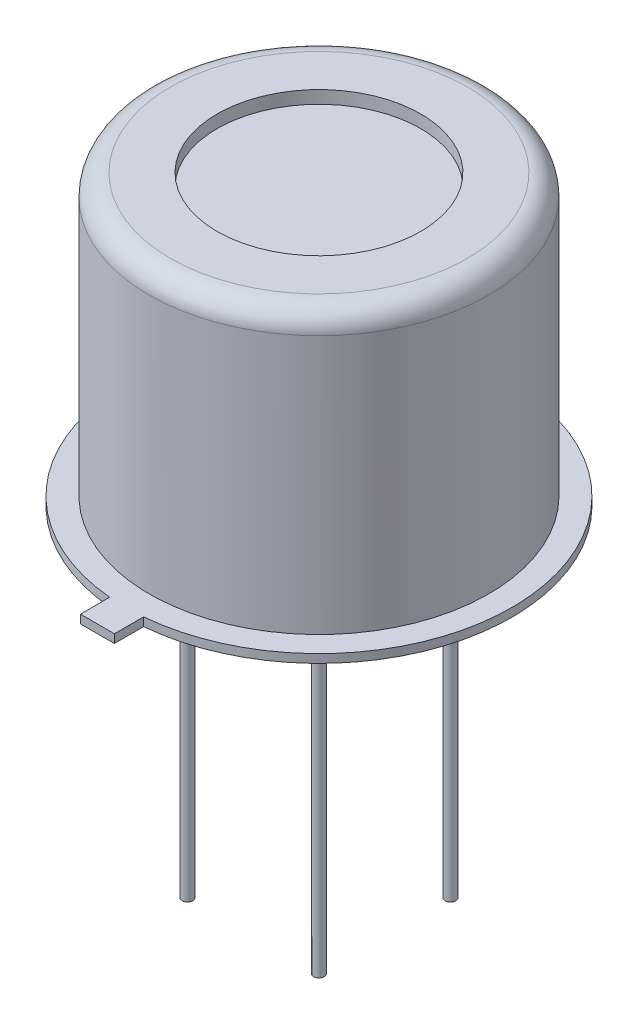
ISO-10303-21;
HEADER;
FILE_DESCRIPTION(('STEP AP214'),'2;1');
FILE_NAME('part.step','',(''),(''),'','','');
FILE_SCHEMA(('AUTOMOTIVE_DESIGN { 1 0 10303 214 1 1 1 1 }'));
ENDSEC;
DATA;
#1=APPLICATION_CONTEXT('core data for automotive mechanical design processes');
#2=APPLICATION_PROTOCOL_DEFINITION('international standard','automotive_design',2000,#1);
#3=PRODUCT_CONTEXT('',#1,'mechanical');
#4=PRODUCT('Part','Part','',(#3));
#5=PRODUCT_RELATED_PRODUCT_CATEGORY('part','',(#4));
#6=PRODUCT_DEFINITION_FORMATION('','',#4);
#7=PRODUCT_DEFINITION_CONTEXT('part definition',#1,'design');
#8=PRODUCT_DEFINITION('design','',#6,#7);
#9=PRODUCT_DEFINITION_SHAPE('','',#8);
#10=(LENGTH_UNIT() NAMED_UNIT(*) SI_UNIT(.MILLI.,.METRE.));
#11=(NAMED_UNIT(*) PLANE_ANGLE_UNIT() SI_UNIT($,.RADIAN.));
#12=(NAMED_UNIT(*) SI_UNIT($,.STERADIAN.) SOLID_ANGLE_UNIT());
#13=UNCERTAINTY_MEASURE_WITH_UNIT(LENGTH_MEASURE(1.E-05),#10,'distance_accuracy_value','');
#14=(GEOMETRIC_REPRESENTATION_CONTEXT(3) GLOBAL_UNCERTAINTY_ASSIGNED_CONTEXT((#13)) GLOBAL_UNIT_ASSIGNED_CONTEXT((#10,
#11,#12)) REPRESENTATION_CONTEXT('',''));
#15=CARTESIAN_POINT('',(0.,0.,0.));
#16=DIRECTION('',(0.,0.,1.));
#17=DIRECTION('',(1.,0.,0.));
#18=AXIS2_PLACEMENT_3D('',#15,#16,#17);
#19=CARTESIAN_POINT('',(0.,-0.2,0.));
#20=DIRECTION('',(0.,-1.,0.));
#21=DIRECTION('',(0.,0.,-1.));
#22=AXIS2_PLACEMENT_3D('',#19,#20,#21);
#23=PLANE('',#22);
#24=CARTESIAN_POINT('',(1.55,-0.2,-1.55));
#25=DIRECTION('',(0.,-1.,0.));
#26=DIRECTION('',(0.,0.,-1.));
#27=AXIS2_PLACEMENT_3D('',#24,#25,#26);
#28=CIRCLE('',#27,0.125);
#29=CARTESIAN_POINT('',(1.55,-0.2,-1.675));
#30=VERTEX_POINT('',#29);
#31=EDGE_CURVE('E312',#30,#30,#28,.T.);
#32=ORIENTED_EDGE('',*,*,#31,.F.);
#33=EDGE_LOOP('',(#32));
#34=FACE_BOUND('',#33,.T.);
#35=CARTESIAN_POINT('',(-1.55,-0.2,1.55));
#36=DIRECTION('',(0.,-1.,0.));
#37=DIRECTION('',(0.,0.,-1.));
#38=AXIS2_PLACEMENT_3D('',#35,#36,#37);
#39=CIRCLE('',#38,0.125);
#40=CARTESIAN_POINT('',(-1.55,-0.2,1.425));
#41=VERTEX_POINT('',#40);
#42=EDGE_CURVE('E327',#41,#41,#39,.T.);
#43=ORIENTED_EDGE('',*,*,#42,.F.);
#44=EDGE_LOOP('',(#43));
#45=FACE_BOUND('',#44,.T.);
#46=CARTESIAN_POINT('',(0.,-0.2,0.));
#47=DIRECTION('',(0.,-1.,0.));
#48=DIRECTION('',(0.,0.,-1.));
#49=AXIS2_PLACEMENT_3D('',#46,#47,#48);
#50=CIRCLE('',#49,4.55);
#51=CARTESIAN_POINT('',(-0.4,-0.2,4.53238347892144));
#52=VERTEX_POINT('',#51);
#53=CARTESIAN_POINT('',(0.4,-0.2,4.53238347892144));
#54=VERTEX_POINT('',#53);
#55=EDGE_CURVE('E112',#52,#54,#50,.T.);
#56=ORIENTED_EDGE('',*,*,#55,.T.);
#57=DIRECTION('',(0.,0.,1.));
#58=VECTOR('',#57,1.);
#59=CARTESIAN_POINT('',(0.4,-0.2,5.22227190057123));
#60=LINE('',#59,#58);
#61=CARTESIAN_POINT('',(0.4,-0.2,5.22227190057123));
#62=VERTEX_POINT('',#61);
#63=EDGE_CURVE('E103',#54,#62,#60,.T.);
#64=ORIENTED_EDGE('',*,*,#63,.T.);
#65=DIRECTION('',(-1.,0.,0.));
#66=VECTOR('',#65,1.);
#67=CARTESIAN_POINT('',(-0.4,-0.2,5.22227190057123));
#68=LINE('',#67,#66);
#69=CARTESIAN_POINT('',(-0.4,-0.2,5.22227190057123));
#70=VERTEX_POINT('',#69);
#71=EDGE_CURVE('E94',#62,#70,#68,.T.);
#72=ORIENTED_EDGE('',*,*,#71,.T.);
#73=DIRECTION('',(0.,0.,-1.));
#74=VECTOR('',#73,1.);
#75=CARTESIAN_POINT('',(-0.4,-0.2,5.22227190057123));
#76=LINE('',#75,#74);
#77=EDGE_CURVE('E50',#70,#52,#76,.T.);
#78=ORIENTED_EDGE('',*,*,#77,.T.);
#79=EDGE_LOOP('',(#56,#64,#72,#78));
#80=FACE_BOUND('',#79,.T.);
#81=CARTESIAN_POINT('',(1.55,-0.2,1.55));
#82=DIRECTION('',(0.,-1.,0.));
#83=DIRECTION('',(0.,0.,1.));
#84=AXIS2_PLACEMENT_3D('',#81,#82,#83);
#85=CIRCLE('',#84,0.125);
#86=CARTESIAN_POINT('',(1.55,-0.2,1.675));
#87=VERTEX_POINT('',#86);
#88=EDGE_CURVE('E322',#87,#87,#85,.T.);
#89=ORIENTED_EDGE('',*,*,#88,.F.);
#90=EDGE_LOOP('',(#89));
#91=FACE_BOUND('',#90,.T.);
#92=CARTESIAN_POINT('',(-1.55,-0.2,-1.55));
#93=DIRECTION('',(0.,-1.,0.));
#94=DIRECTION('',(0.,0.,1.));
#95=AXIS2_PLACEMENT_3D('',#92,#93,#94);
#96=CIRCLE('',#95,0.125);
#97=CARTESIAN_POINT('',(-1.55,-0.2,-1.425));
#98=VERTEX_POINT('',#97);
#99=EDGE_CURVE('E313',#98,#98,#96,.T.);
#100=ORIENTED_EDGE('',*,*,#99,.F.);
#101=EDGE_LOOP('',(#100));
#102=FACE_BOUND('',#101,.T.);
#103=ADVANCED_FACE('F35',(#34,#45,#80,#91,#102),#23,.T.);
#104=CARTESIAN_POINT('',(0.,6.6,0.));
#105=DIRECTION('',(0.,-1.,0.));
#106=DIRECTION('',(0.,0.,-1.));
#107=AXIS2_PLACEMENT_3D('',#104,#105,#106);
#108=CYLINDRICAL_SURFACE('',#107,4.);
#109=CARTESIAN_POINT('',(0.,6.1,0.));
#110=DIRECTION('',(0.,1.,0.));
#111=DIRECTION('',(0.,0.,1.));
#112=AXIS2_PLACEMENT_3D('',#109,#110,#111);
#113=CIRCLE('',#112,4.);
#114=CARTESIAN_POINT('',(0.,6.1,4.));
#115=VERTEX_POINT('',#114);
#116=EDGE_CURVE('E11',#115,#115,#113,.F.);
#117=ORIENTED_EDGE('',*,*,#116,.T.);
#118=EDGE_LOOP('',(#117));
#119=FACE_BOUND('',#118,.T.);
#120=CARTESIAN_POINT('',(0.,0.,0.));
#121=DIRECTION('',(0.,-1.,0.));
#122=DIRECTION('',(0.,0.,-1.));
#123=AXIS2_PLACEMENT_3D('',#120,#121,#122);
#124=CIRCLE('',#123,4.);
#125=CARTESIAN_POINT('',(0.,0.,-4.));
#126=VERTEX_POINT('',#125);
#127=EDGE_CURVE('E114',#126,#126,#124,.T.);
#128=ORIENTED_EDGE('',*,*,#127,.F.);
#129=EDGE_LOOP('',(#128));
#130=FACE_BOUND('',#129,.T.);
#131=ADVANCED_FACE('F139',(#119,#130),#108,.T.);
#132=CARTESIAN_POINT('',(0.,6.6,0.));
#133=DIRECTION('',(0.,1.,0.));
#134=DIRECTION('',(0.,0.,1.));
#135=AXIS2_PLACEMENT_3D('',#132,#133,#134);
#136=PLANE('',#135);
#137=CARTESIAN_POINT('',(0.,6.6,0.));
#138=DIRECTION('',(0.,1.,0.));
#139=DIRECTION('',(0.,0.,1.));
#140=AXIS2_PLACEMENT_3D('',#137,#138,#139);
#141=CIRCLE('',#140,3.5);
#142=CARTESIAN_POINT('',(0.,6.6,3.5));
#143=VERTEX_POINT('',#142);
#144=EDGE_CURVE('E43',#143,#143,#141,.T.);
#145=ORIENTED_EDGE('',*,*,#144,.T.);
#146=EDGE_LOOP('',(#145));
#147=FACE_BOUND('',#146,.T.);
#148=CARTESIAN_POINT('',(0.,6.6,0.));
#149=DIRECTION('',(0.,1.,0.));
#150=DIRECTION('',(0.,0.,1.));
#151=AXIS2_PLACEMENT_3D('',#148,#149,#150);
#152=CIRCLE('',#151,2.4);
#153=CARTESIAN_POINT('',(0.,6.6,2.4));
#154=VERTEX_POINT('',#153);
#155=EDGE_CURVE('E333',#154,#154,#152,.T.);
#156=ORIENTED_EDGE('',*,*,#155,.F.);
#157=EDGE_LOOP('',(#156));
#158=FACE_BOUND('',#157,.T.);
#159=ADVANCED_FACE('F120',(#147,#158),#136,.T.);
#160=CARTESIAN_POINT('',(0.,0.,0.));
#161=DIRECTION('',(0.,-1.,0.));
#162=DIRECTION('',(0.,0.,-1.));
#163=AXIS2_PLACEMENT_3D('',#160,#161,#162);
#164=PLANE('',#163);
#165=DIRECTION('',(0.,0.,1.));
#166=VECTOR('',#165,1.);
#167=CARTESIAN_POINT('',(0.4,0.,5.22227190057123));
#168=LINE('',#167,#166);
#169=CARTESIAN_POINT('',(0.4,0.,4.53238347892144));
#170=VERTEX_POINT('',#169);
#171=CARTESIAN_POINT('',(0.4,0.,5.22227190057123));
#172=VERTEX_POINT('',#171);
#173=EDGE_CURVE('E78',#170,#172,#168,.T.);
#174=ORIENTED_EDGE('',*,*,#173,.F.);
#175=CARTESIAN_POINT('',(0.,0.,0.));
#176=DIRECTION('',(0.,-1.,0.));
#177=DIRECTION('',(0.,0.,-1.));
#178=AXIS2_PLACEMENT_3D('',#175,#176,#177);
#179=CIRCLE('',#178,4.55);
#180=CARTESIAN_POINT('',(-0.4,0.,4.53238347892144));
#181=VERTEX_POINT('',#180);
#182=EDGE_CURVE('E111',#181,#170,#179,.T.);
#183=ORIENTED_EDGE('',*,*,#182,.F.);
#184=DIRECTION('',(0.,0.,-1.));
#185=VECTOR('',#184,1.);
#186=CARTESIAN_POINT('',(-0.4,0.,5.22227190057123));
#187=LINE('',#186,#185);
#188=CARTESIAN_POINT('',(-0.4,0.,5.22227190057123));
#189=VERTEX_POINT('',#188);
#190=EDGE_CURVE('E57',#189,#181,#187,.T.);
#191=ORIENTED_EDGE('',*,*,#190,.F.);
#192=DIRECTION('',(-1.,0.,0.));
#193=VECTOR('',#192,1.);
#194=CARTESIAN_POINT('',(-0.4,0.,5.22227190057123));
#195=LINE('',#194,#193);
#196=EDGE_CURVE('E89',#172,#189,#195,.T.);
#197=ORIENTED_EDGE('',*,*,#196,.F.);
#198=EDGE_LOOP('',(#174,#183,#191,#197));
#199=FACE_BOUND('',#198,.T.);
#200=ORIENTED_EDGE('',*,*,#127,.T.);
#201=EDGE_LOOP('',(#200));
#202=FACE_BOUND('',#201,.T.);
#203=ADVANCED_FACE('F97',(#199,#202),#164,.F.);
#204=CARTESIAN_POINT('',(0.,-0.2,0.));
#205=DIRECTION('',(0.,1.,0.));
#206=DIRECTION('',(0.,0.,1.));
#207=AXIS2_PLACEMENT_3D('',#204,#205,#206);
#208=CYLINDRICAL_SURFACE('',#207,4.55);
#209=ORIENTED_EDGE('',*,*,#55,.F.);
#210=DIRECTION('',(0.,1.,0.));
#211=VECTOR('',#210,1.);
#212=CARTESIAN_POINT('',(-0.4,-0.2,4.53238347892144));
#213=LINE('',#212,#211);
#214=EDGE_CURVE('E109',#52,#181,#213,.T.);
#215=ORIENTED_EDGE('',*,*,#214,.T.);
#216=ORIENTED_EDGE('',*,*,#182,.T.);
#217=DIRECTION('',(0.,1.,0.));
#218=VECTOR('',#217,1.);
#219=CARTESIAN_POINT('',(0.4,-0.2,4.53238347892144));
#220=LINE('',#219,#218);
#221=EDGE_CURVE('E84',#170,#54,#220,.F.);
#222=ORIENTED_EDGE('',*,*,#221,.T.);
#223=EDGE_LOOP('',(#209,#215,#216,#222));
#224=FACE_BOUND('',#223,.T.);
#225=ADVANCED_FACE('F154',(#224),#208,.T.);
#226=CARTESIAN_POINT('',(-0.4,0.,5.22227190057123));
#227=DIRECTION('',(-1.,0.,0.));
#228=DIRECTION('',(0.,0.,1.));
#229=AXIS2_PLACEMENT_3D('',#226,#227,#228);
#230=PLANE('',#229);
#231=ORIENTED_EDGE('',*,*,#214,.F.);
#232=ORIENTED_EDGE('',*,*,#77,.F.);
#233=DIRECTION('',(0.,-1.,0.));
#234=VECTOR('',#233,1.);
#235=CARTESIAN_POINT('',(-0.4,0.,5.22227190057123));
#236=LINE('',#235,#234);
#237=EDGE_CURVE('E95',#189,#70,#236,.T.);
#238=ORIENTED_EDGE('',*,*,#237,.F.);
#239=ORIENTED_EDGE('',*,*,#190,.T.);
#240=EDGE_LOOP('',(#231,#232,#238,#239));
#241=FACE_BOUND('',#240,.T.);
#242=ADVANCED_FACE('F150',(#241),#230,.T.);
#243=CARTESIAN_POINT('',(0.4,0.,5.22227190057123));
#244=DIRECTION('',(1.,0.,0.));
#245=DIRECTION('',(0.,0.,-1.));
#246=AXIS2_PLACEMENT_3D('',#243,#244,#245);
#247=PLANE('',#246);
#248=ORIENTED_EDGE('',*,*,#221,.F.);
#249=ORIENTED_EDGE('',*,*,#173,.T.);
#250=DIRECTION('',(0.,-1.,0.));
#251=VECTOR('',#250,1.);
#252=CARTESIAN_POINT('',(0.4,0.,5.22227190057123));
#253=LINE('',#252,#251);
#254=EDGE_CURVE('E81',#172,#62,#253,.T.);
#255=ORIENTED_EDGE('',*,*,#254,.T.);
#256=ORIENTED_EDGE('',*,*,#63,.F.);
#257=EDGE_LOOP('',(#248,#249,#255,#256));
#258=FACE_BOUND('',#257,.T.);
#259=ADVANCED_FACE('F80',(#258),#247,.T.);
#260=CARTESIAN_POINT('',(-0.4,0.,5.22227190057123));
#261=DIRECTION('',(0.,0.,1.));
#262=DIRECTION('',(1.,0.,0.));
#263=AXIS2_PLACEMENT_3D('',#260,#261,#262);
#264=PLANE('',#263);
#265=ORIENTED_EDGE('',*,*,#71,.F.);
#266=ORIENTED_EDGE('',*,*,#254,.F.);
#267=ORIENTED_EDGE('',*,*,#196,.T.);
#268=ORIENTED_EDGE('',*,*,#237,.T.);
#269=EDGE_LOOP('',(#265,#266,#267,#268));
#270=FACE_BOUND('',#269,.T.);
#271=ADVANCED_FACE('F93',(#270),#264,.T.);
#272=CARTESIAN_POINT('',(0.,6.3,0.));
#273=DIRECTION('',(0.,1.,0.));
#274=DIRECTION('',(0.,0.,1.));
#275=AXIS2_PLACEMENT_3D('',#272,#273,#274);
#276=CYLINDRICAL_SURFACE('',#275,2.4);
#277=CARTESIAN_POINT('',(0.,6.3,0.));
#278=DIRECTION('',(0.,1.,0.));
#279=DIRECTION('',(0.,0.,1.));
#280=AXIS2_PLACEMENT_3D('',#277,#278,#279);
#281=CIRCLE('',#280,2.4);
#282=CARTESIAN_POINT('',(0.,6.3,2.4));
#283=VERTEX_POINT('',#282);
#284=EDGE_CURVE('E104',#283,#283,#281,.T.);
#285=ORIENTED_EDGE('',*,*,#284,.F.);
#286=EDGE_LOOP('',(#285));
#287=FACE_BOUND('',#286,.T.);
#288=ORIENTED_EDGE('',*,*,#155,.T.);
#289=EDGE_LOOP('',(#288));
#290=FACE_BOUND('',#289,.T.);
#291=ADVANCED_FACE('F134',(#287,#290),#276,.F.);
#292=CARTESIAN_POINT('',(0.,6.3,0.));
#293=DIRECTION('',(0.,1.,0.));
#294=DIRECTION('',(0.,0.,1.));
#295=AXIS2_PLACEMENT_3D('',#292,#293,#294);
#296=PLANE('',#295);
#297=ORIENTED_EDGE('',*,*,#284,.T.);
#298=EDGE_LOOP('',(#297));
#299=FACE_BOUND('',#298,.T.);
#300=ADVANCED_FACE('F125',(#299),#296,.T.);
#301=CARTESIAN_POINT('',(0.,6.1,0.));
#302=DIRECTION('',(0.,1.,0.));
#303=DIRECTION('',(0.,0.,1.));
#304=AXIS2_PLACEMENT_3D('',#301,#302,#303);
#305=TOROIDAL_SURFACE('',#304,3.5,0.5);
#306=ORIENTED_EDGE('',*,*,#116,.F.);
#307=EDGE_LOOP('',(#306));
#308=FACE_BOUND('',#307,.T.);
#309=ORIENTED_EDGE('',*,*,#144,.F.);
#310=EDGE_LOOP('',(#309));
#311=FACE_BOUND('',#310,.T.);
#312=ADVANCED_FACE('F37',(#308,#311),#305,.T.);
#313=CARTESIAN_POINT('',(-1.55,-8.2,1.55));
#314=DIRECTION('',(0.,1.,0.));
#315=DIRECTION('',(0.,0.,1.));
#316=AXIS2_PLACEMENT_3D('',#313,#314,#315);
#317=CYLINDRICAL_SURFACE('',#316,0.125);
#318=CARTESIAN_POINT('',(-1.55,-8.2,1.55));
#319=DIRECTION('',(0.,-1.,0.));
#320=DIRECTION('',(0.,0.,-1.));
#321=AXIS2_PLACEMENT_3D('',#318,#319,#320);
#322=CIRCLE('',#321,0.125);
#323=CARTESIAN_POINT('',(-1.55,-8.2,1.425));
#324=VERTEX_POINT('',#323);
#325=EDGE_CURVE('E330',#324,#324,#322,.T.);
#326=ORIENTED_EDGE('',*,*,#325,.F.);
#327=EDGE_LOOP('',(#326));
#328=FACE_BOUND('',#327,.T.);
#329=ORIENTED_EDGE('',*,*,#42,.T.);
#330=EDGE_LOOP('',(#329));
#331=FACE_BOUND('',#330,.T.);
#332=ADVANCED_FACE('F124',(#328,#331),#317,.T.);
#333=CARTESIAN_POINT('',(-1.55,-8.2,1.55));
#334=DIRECTION('',(0.,-1.,0.));
#335=DIRECTION('',(0.,0.,-1.));
#336=AXIS2_PLACEMENT_3D('',#333,#334,#335);
#337=PLANE('',#336);
#338=ORIENTED_EDGE('',*,*,#325,.T.);
#339=EDGE_LOOP('',(#338));
#340=FACE_BOUND('',#339,.T.);
#341=ADVANCED_FACE('F131',(#340),#337,.T.);
#342=CARTESIAN_POINT('',(1.55,-8.2,1.55));
#343=DIRECTION('',(0.,1.,0.));
#344=DIRECTION('',(0.,0.,1.));
#345=AXIS2_PLACEMENT_3D('',#342,#343,#344);
#346=CYLINDRICAL_SURFACE('',#345,0.125);
#347=CARTESIAN_POINT('',(1.55,-8.2,1.55));
#348=DIRECTION('',(0.,-1.,0.));
#349=DIRECTION('',(0.,0.,1.));
#350=AXIS2_PLACEMENT_3D('',#347,#348,#349);
#351=CIRCLE('',#350,0.125);
#352=CARTESIAN_POINT('',(1.55,-8.2,1.675));
#353=VERTEX_POINT('',#352);
#354=EDGE_CURVE('E324',#353,#353,#351,.T.);
#355=ORIENTED_EDGE('',*,*,#354,.F.);
#356=EDGE_LOOP('',(#355));
#357=FACE_BOUND('',#356,.T.);
#358=ORIENTED_EDGE('',*,*,#88,.T.);
#359=EDGE_LOOP('',(#358));
#360=FACE_BOUND('',#359,.T.);
#361=ADVANCED_FACE('F245',(#357,#360),#346,.T.);
#362=CARTESIAN_POINT('',(1.55,-8.2,1.55));
#363=DIRECTION('',(0.,1.,0.));
#364=DIRECTION('',(0.,0.,1.));
#365=AXIS2_PLACEMENT_3D('',#362,#363,#364);
#366=PLANE('',#365);
#367=ORIENTED_EDGE('',*,*,#354,.T.);
#368=EDGE_LOOP('',(#367));
#369=FACE_BOUND('',#368,.T.);
#370=ADVANCED_FACE('F254',(#369),#366,.F.);
#371=CARTESIAN_POINT('',(1.55,-8.2,-1.55));
#372=DIRECTION('',(0.,1.,0.));
#373=DIRECTION('',(0.,0.,1.));
#374=AXIS2_PLACEMENT_3D('',#371,#372,#373);
#375=CYLINDRICAL_SURFACE('',#374,0.125);
#376=CARTESIAN_POINT('',(1.55,-8.2,-1.55));
#377=DIRECTION('',(0.,-1.,0.));
#378=DIRECTION('',(0.,0.,-1.));
#379=AXIS2_PLACEMENT_3D('',#376,#377,#378);
#380=CIRCLE('',#379,0.125);
#381=CARTESIAN_POINT('',(1.55,-8.2,-1.675));
#382=VERTEX_POINT('',#381);
#383=EDGE_CURVE('E316',#382,#382,#380,.T.);
#384=ORIENTED_EDGE('',*,*,#383,.F.);
#385=EDGE_LOOP('',(#384));
#386=FACE_BOUND('',#385,.T.);
#387=ORIENTED_EDGE('',*,*,#31,.T.);
#388=EDGE_LOOP('',(#387));
#389=FACE_BOUND('',#388,.T.);
#390=ADVANCED_FACE('F263',(#386,#389),#375,.T.);
#391=CARTESIAN_POINT('',(1.55,-8.2,-1.55));
#392=DIRECTION('',(0.,-1.,0.));
#393=DIRECTION('',(0.,0.,-1.));
#394=AXIS2_PLACEMENT_3D('',#391,#392,#393);
#395=PLANE('',#394);
#396=ORIENTED_EDGE('',*,*,#383,.T.);
#397=EDGE_LOOP('',(#396));
#398=FACE_BOUND('',#397,.T.);
#399=ADVANCED_FACE('F272',(#398),#395,.T.);
#400=CARTESIAN_POINT('',(-1.55,-8.2,-1.55));
#401=DIRECTION('',(0.,1.,0.));
#402=DIRECTION('',(0.,0.,1.));
#403=AXIS2_PLACEMENT_3D('',#400,#401,#402);
#404=CYLINDRICAL_SURFACE('',#403,0.125);
#405=CARTESIAN_POINT('',(-1.55,-8.2,-1.55));
#406=DIRECTION('',(0.,-1.,0.));
#407=DIRECTION('',(0.,0.,1.));
#408=AXIS2_PLACEMENT_3D('',#405,#406,#407);
#409=CIRCLE('',#408,0.125);
#410=CARTESIAN_POINT('',(-1.55,-8.2,-1.425));
#411=VERTEX_POINT('',#410);
#412=EDGE_CURVE('E311',#411,#411,#409,.T.);
#413=ORIENTED_EDGE('',*,*,#412,.F.);
#414=EDGE_LOOP('',(#413));
#415=FACE_BOUND('',#414,.T.);
#416=ORIENTED_EDGE('',*,*,#99,.T.);
#417=EDGE_LOOP('',(#416));
#418=FACE_BOUND('',#417,.T.);
#419=ADVANCED_FACE('F281',(#415,#418),#404,.T.);
#420=CARTESIAN_POINT('',(-1.55,-8.2,-1.55));
#421=DIRECTION('',(0.,1.,0.));
#422=DIRECTION('',(0.,0.,1.));
#423=AXIS2_PLACEMENT_3D('',#420,#421,#422);
#424=PLANE('',#423);
#425=ORIENTED_EDGE('',*,*,#412,.T.);
#426=EDGE_LOOP('',(#425));
#427=FACE_BOUND('',#426,.T.);
#428=ADVANCED_FACE('F290',(#427),#424,.F.);
#429=CLOSED_SHELL('',(#103,#131,#159,#203,#225,#242,#259,#271,#291,#300,#312,#332,#341,#361,
#370,#390,#399,#419,#428));
#430=MANIFOLD_SOLID_BREP('B2',#429);
#431=ADVANCED_BREP_SHAPE_REPRESENTATION('',(#18,#430),#14);
#432=SHAPE_DEFINITION_REPRESENTATION(#9,#431);
ENDSEC;
END-ISO-10303-21;
